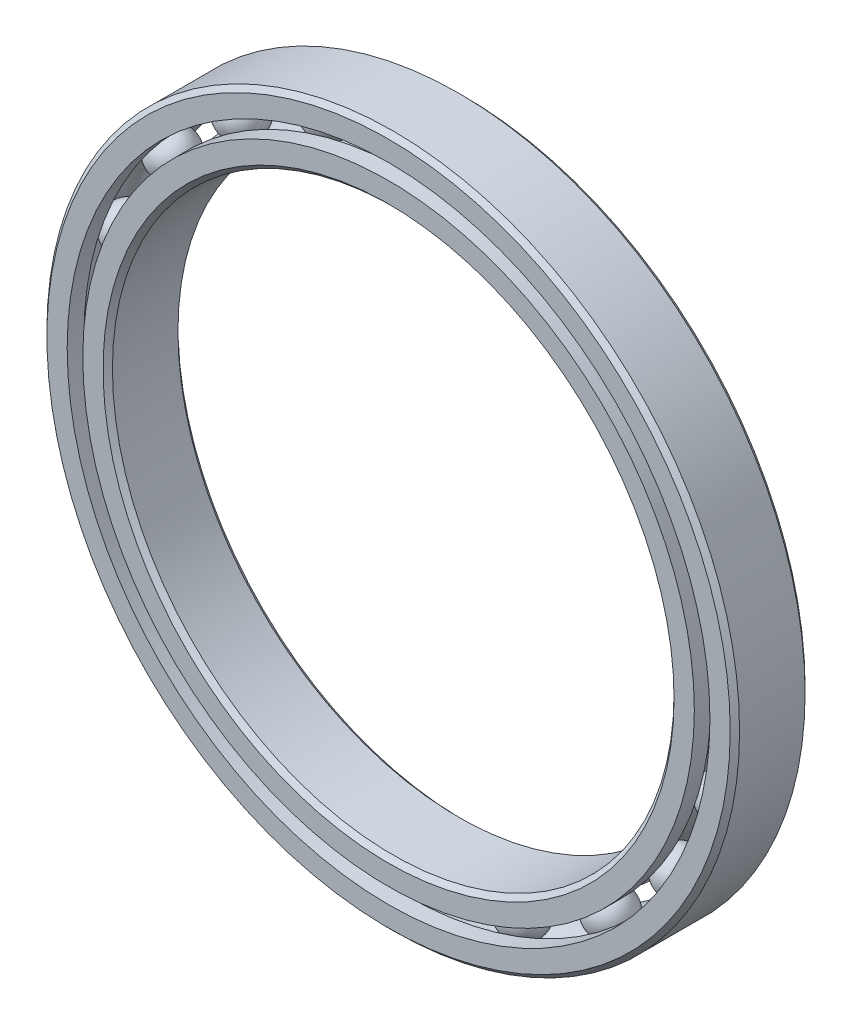
ISO-10303-21;
HEADER;
FILE_DESCRIPTION(('STEP AP214'),'2;1');
FILE_NAME('part.step','',(''),(''),'','','');
FILE_SCHEMA(('AUTOMOTIVE_DESIGN { 1 0 10303 214 1 1 1 1 }'));
ENDSEC;
DATA;
#1=APPLICATION_CONTEXT('core data for automotive mechanical design processes');
#2=APPLICATION_PROTOCOL_DEFINITION('international standard','automotive_design',2000,#1);
#3=PRODUCT_CONTEXT('',#1,'mechanical');
#4=PRODUCT('Part','Part','',(#3));
#5=PRODUCT_RELATED_PRODUCT_CATEGORY('part','',(#4));
#6=PRODUCT_DEFINITION_FORMATION('','',#4);
#7=PRODUCT_DEFINITION_CONTEXT('part definition',#1,'design');
#8=PRODUCT_DEFINITION('design','',#6,#7);
#9=PRODUCT_DEFINITION_SHAPE('','',#8);
#10=(LENGTH_UNIT() NAMED_UNIT(*) SI_UNIT(.MILLI.,.METRE.));
#11=(NAMED_UNIT(*) PLANE_ANGLE_UNIT() SI_UNIT($,.RADIAN.));
#12=(NAMED_UNIT(*) SI_UNIT($,.STERADIAN.) SOLID_ANGLE_UNIT());
#13=UNCERTAINTY_MEASURE_WITH_UNIT(LENGTH_MEASURE(1.E-05),#10,'distance_accuracy_value','');
#14=(GEOMETRIC_REPRESENTATION_CONTEXT(3) GLOBAL_UNCERTAINTY_ASSIGNED_CONTEXT((#13)) GLOBAL_UNIT_ASSIGNED_CONTEXT((#10,
#11,#12)) REPRESENTATION_CONTEXT('',''));
#15=CARTESIAN_POINT('',(0.,0.,0.));
#16=DIRECTION('',(0.,0.,1.));
#17=DIRECTION('',(1.,0.,0.));
#18=AXIS2_PLACEMENT_3D('',#15,#16,#17);
#19=CARTESIAN_POINT('',(-5.17603465578016,15.9301966479439,0.));
#20=DIRECTION('',(0.,0.,1.));
#21=DIRECTION('',(-0.309016994374935,0.951056516295158,0.));
#22=AXIS2_PLACEMENT_3D('',#19,#20,#21);
#23=SPHERICAL_SURFACE('',#22,1.18671409240088);
#24=CARTESIAN_POINT('',(-5.17603465578016,15.9301966479439,1.18671409240088));
#25=VERTEX_POINT('',#24);
#26=VERTEX_LOOP('',#25);
#27=FACE_BOUND('',#26,.T.);
#28=ADVANCED_FACE('F38',(#27),#23,.T.);
#29=CLOSED_SHELL('',(#28));
#30=MANIFOLD_SOLID_BREP('B2',#29);
#31=CARTESIAN_POINT('',(-9.84540297589875,13.5510346557805,0.));
#32=DIRECTION('',(0.,0.,1.));
#33=DIRECTION('',(-0.587785252292462,0.809016994374955,0.));
#34=AXIS2_PLACEMENT_3D('',#31,#32,#33);
#35=SPHERICAL_SURFACE('',#34,1.18671409240088);
#36=CARTESIAN_POINT('',(-9.84540297589875,13.5510346557805,1.18671409240088));
#37=VERTEX_POINT('',#36);
#38=VERTEX_LOOP('',#37);
#39=FACE_BOUND('',#38,.T.);
#40=ADVANCED_FACE('F59',(#39),#35,.T.);
#41=CLOSED_SHELL('',(#40));
#42=MANIFOLD_SOLID_BREP('B6',#41);
#43=CARTESIAN_POINT('',(-13.5510346557802,9.84540297589909,0.));
#44=DIRECTION('',(0.,0.,1.));
#45=DIRECTION('',(-0.80901699437494,0.587785252292483,0.));
#46=AXIS2_PLACEMENT_3D('',#43,#44,#45);
#47=SPHERICAL_SURFACE('',#46,1.18671409240088);
#48=CARTESIAN_POINT('',(-13.5510346557802,9.84540297589909,1.18671409240088));
#49=VERTEX_POINT('',#48);
#50=VERTEX_LOOP('',#49);
#51=FACE_BOUND('',#50,.T.);
#52=ADVANCED_FACE('F80',(#51),#47,.T.);
#53=CLOSED_SHELL('',(#52));
#54=MANIFOLD_SOLID_BREP('B34',#53);
#55=CARTESIAN_POINT('',(-15.9301966479438,5.17603465578055,0.));
#56=DIRECTION('',(0.,0.,1.));
#57=DIRECTION('',(-0.95105651629515,0.309016994374958,0.));
#58=AXIS2_PLACEMENT_3D('',#55,#56,#57);
#59=SPHERICAL_SURFACE('',#58,1.18671409240088);
#60=CARTESIAN_POINT('',(-15.9301966479438,5.17603465578055,1.18671409240088));
#61=VERTEX_POINT('',#60);
#62=VERTEX_LOOP('',#61);
#63=FACE_BOUND('',#62,.T.);
#64=ADVANCED_FACE('F101',(#63),#59,.T.);
#65=CLOSED_SHELL('',(#64));
#66=MANIFOLD_SOLID_BREP('B55',#65);
#67=CARTESIAN_POINT('',(-16.75,1.75446937276867E-13,0.));
#68=DIRECTION('',(0.,0.,1.));
#69=DIRECTION('',(-1.,0.,0.));
#70=AXIS2_PLACEMENT_3D('',#67,#68,#69);
#71=SPHERICAL_SURFACE('',#70,1.18671409240088);
#72=CARTESIAN_POINT('',(-16.75,1.75446937276867E-13,1.18671409240088));
#73=VERTEX_POINT('',#72);
#74=VERTEX_LOOP('',#73);
#75=FACE_BOUND('',#74,.T.);
#76=ADVANCED_FACE('F122',(#75),#71,.T.);
#77=CLOSED_SHELL('',(#76));
#78=MANIFOLD_SOLID_BREP('B76',#77);
#79=CARTESIAN_POINT('',(-15.9301966479439,-5.17603465578022,0.));
#80=DIRECTION('',(0.,0.,1.));
#81=DIRECTION('',(-0.951056516295157,-0.309016994374938,0.));
#82=AXIS2_PLACEMENT_3D('',#79,#80,#81);
#83=SPHERICAL_SURFACE('',#82,1.18671409240088);
#84=CARTESIAN_POINT('',(-15.9301966479439,-5.17603465578022,1.18671409240088));
#85=VERTEX_POINT('',#84);
#86=VERTEX_LOOP('',#85);
#87=FACE_BOUND('',#86,.T.);
#88=ADVANCED_FACE('F143',(#87),#83,.T.);
#89=CLOSED_SHELL('',(#88));
#90=MANIFOLD_SOLID_BREP('B97',#89);
#91=CARTESIAN_POINT('',(-13.5510346557805,-9.84540297589879,0.));
#92=DIRECTION('',(0.,0.,1.));
#93=DIRECTION('',(-0.809016994374953,-0.587785252292465,0.));
#94=AXIS2_PLACEMENT_3D('',#91,#92,#93);
#95=SPHERICAL_SURFACE('',#94,1.18671409240088);
#96=CARTESIAN_POINT('',(-13.5510346557805,-9.84540297589879,1.18671409240088));
#97=VERTEX_POINT('',#96);
#98=VERTEX_LOOP('',#97);
#99=FACE_BOUND('',#98,.T.);
#100=ADVANCED_FACE('F164',(#99),#95,.T.);
#101=CLOSED_SHELL('',(#100));
#102=MANIFOLD_SOLID_BREP('B118',#101);
#103=CARTESIAN_POINT('',(-9.84540297589905,-13.5510346557803,0.));
#104=DIRECTION('',(0.,0.,1.));
#105=DIRECTION('',(-0.58778525229248,-0.809016994374942,0.));
#106=AXIS2_PLACEMENT_3D('',#103,#104,#105);
#107=SPHERICAL_SURFACE('',#106,1.18671409240088);
#108=CARTESIAN_POINT('',(-9.84540297589905,-13.5510346557803,1.18671409240088));
#109=VERTEX_POINT('',#108);
#110=VERTEX_LOOP('',#109);
#111=FACE_BOUND('',#110,.T.);
#112=ADVANCED_FACE('F185',(#111),#107,.T.);
#113=CLOSED_SHELL('',(#112));
#114=MANIFOLD_SOLID_BREP('B139',#113);
#115=CARTESIAN_POINT('',(-5.17603465578049,-15.9301966479438,0.));
#116=DIRECTION('',(0.,0.,1.));
#117=DIRECTION('',(-0.309016994374955,-0.951056516295151,0.));
#118=AXIS2_PLACEMENT_3D('',#115,#116,#117);
#119=SPHERICAL_SURFACE('',#118,1.18671409240088);
#120=CARTESIAN_POINT('',(-5.17603465578049,-15.9301966479438,1.18671409240088));
#121=VERTEX_POINT('',#120);
#122=VERTEX_LOOP('',#121);
#123=FACE_BOUND('',#122,.T.);
#124=ADVANCED_FACE('F206',(#123),#119,.T.);
#125=CLOSED_SHELL('',(#124));
#126=MANIFOLD_SOLID_BREP('B160',#125);
#127=CARTESIAN_POINT('',(-1.16964624851245E-13,-16.75,0.));
#128=DIRECTION('',(0.,0.,1.));
#129=DIRECTION('',(0.,-1.,0.));
#130=AXIS2_PLACEMENT_3D('',#127,#128,#129);
#131=SPHERICAL_SURFACE('',#130,1.18671409240088);
#132=CARTESIAN_POINT('',(-1.16964624851245E-13,-16.75,1.18671409240088));
#133=VERTEX_POINT('',#132);
#134=VERTEX_LOOP('',#133);
#135=FACE_BOUND('',#134,.T.);
#136=ADVANCED_FACE('F227',(#135),#131,.T.);
#137=CLOSED_SHELL('',(#136));
#138=MANIFOLD_SOLID_BREP('B181',#137);
#139=CARTESIAN_POINT('',(5.17603465578026,-15.9301966479439,0.));
#140=DIRECTION('',(0.,0.,1.));
#141=DIRECTION('',(0.309016994374941,-0.951056516295156,0.));
#142=AXIS2_PLACEMENT_3D('',#139,#140,#141);
#143=SPHERICAL_SURFACE('',#142,1.18671409240088);
#144=CARTESIAN_POINT('',(5.17603465578026,-15.9301966479439,1.18671409240088));
#145=VERTEX_POINT('',#144);
#146=VERTEX_LOOP('',#145);
#147=FACE_BOUND('',#146,.T.);
#148=ADVANCED_FACE('F248',(#147),#143,.T.);
#149=CLOSED_SHELL('',(#148));
#150=MANIFOLD_SOLID_BREP('B202',#149);
#151=CARTESIAN_POINT('',(9.84540297589885,-13.5510346557804,0.));
#152=DIRECTION('',(0.,0.,1.));
#153=DIRECTION('',(0.587785252292469,-0.809016994374951,0.));
#154=AXIS2_PLACEMENT_3D('',#151,#152,#153);
#155=SPHERICAL_SURFACE('',#154,1.18671409240088);
#156=CARTESIAN_POINT('',(9.84540297589885,-13.5510346557804,1.18671409240088));
#157=VERTEX_POINT('',#156);
#158=VERTEX_LOOP('',#157);
#159=FACE_BOUND('',#158,.T.);
#160=ADVANCED_FACE('F269',(#159),#155,.T.);
#161=CLOSED_SHELL('',(#160));
#162=MANIFOLD_SOLID_BREP('B223',#161);
#163=CARTESIAN_POINT('',(13.5510346557803,-9.84540297589899,0.));
#164=DIRECTION('',(0.,0.,1.));
#165=DIRECTION('',(0.809016994374945,-0.587785252292477,0.));
#166=AXIS2_PLACEMENT_3D('',#163,#164,#165);
#167=SPHERICAL_SURFACE('',#166,1.18671409240088);
#168=CARTESIAN_POINT('',(13.5510346557803,-9.84540297589899,1.18671409240088));
#169=VERTEX_POINT('',#168);
#170=VERTEX_LOOP('',#169);
#171=FACE_BOUND('',#170,.T.);
#172=ADVANCED_FACE('F290',(#171),#167,.T.);
#173=CLOSED_SHELL('',(#172));
#174=MANIFOLD_SOLID_BREP('B244',#173);
#175=CARTESIAN_POINT('',(15.9301966479438,-5.17603465578044,0.));
#176=DIRECTION('',(0.,0.,1.));
#177=DIRECTION('',(0.951056516295152,-0.309016994374952,0.));
#178=AXIS2_PLACEMENT_3D('',#175,#176,#177);
#179=SPHERICAL_SURFACE('',#178,1.18671409240088);
#180=CARTESIAN_POINT('',(15.9301966479438,-5.17603465578044,1.18671409240088));
#181=VERTEX_POINT('',#180);
#182=VERTEX_LOOP('',#181);
#183=FACE_BOUND('',#182,.T.);
#184=ADVANCED_FACE('F311',(#183),#179,.T.);
#185=CLOSED_SHELL('',(#184));
#186=MANIFOLD_SOLID_BREP('B265',#185);
#187=CARTESIAN_POINT('',(16.75,0.,0.));
#188=DIRECTION('',(0.,0.,1.));
#189=DIRECTION('',(1.,0.,0.));
#190=AXIS2_PLACEMENT_3D('',#187,#188,#189);
#191=SPHERICAL_SURFACE('',#190,1.18671409240088);
#192=CARTESIAN_POINT('',(16.75,0.,1.18671409240088));
#193=VERTEX_POINT('',#192);
#194=VERTEX_LOOP('',#193);
#195=FACE_BOUND('',#194,.T.);
#196=ADVANCED_FACE('F332',(#195),#191,.T.);
#197=CLOSED_SHELL('',(#196));
#198=MANIFOLD_SOLID_BREP('B286',#197);
#199=CARTESIAN_POINT('',(15.9301966479438,5.17603465578033,0.));
#200=DIRECTION('',(0.,0.,1.));
#201=DIRECTION('',(0.951056516295155,0.309016994374945,0.));
#202=AXIS2_PLACEMENT_3D('',#199,#200,#201);
#203=SPHERICAL_SURFACE('',#202,1.18671409240088);
#204=CARTESIAN_POINT('',(15.9301966479438,5.17603465578033,1.18671409240088));
#205=VERTEX_POINT('',#204);
#206=VERTEX_LOOP('',#205);
#207=FACE_BOUND('',#206,.T.);
#208=ADVANCED_FACE('F353',(#207),#203,.T.);
#209=CLOSED_SHELL('',(#208));
#210=MANIFOLD_SOLID_BREP('B307',#209);
#211=CARTESIAN_POINT('',(13.5510346557804,9.8454029758989,0.));
#212=DIRECTION('',(0.,0.,1.));
#213=DIRECTION('',(0.809016994374949,0.587785252292471,0.));
#214=AXIS2_PLACEMENT_3D('',#211,#212,#213);
#215=SPHERICAL_SURFACE('',#214,1.18671409240088);
#216=CARTESIAN_POINT('',(13.5510346557804,9.8454029758989,1.18671409240088));
#217=VERTEX_POINT('',#216);
#218=VERTEX_LOOP('',#217);
#219=FACE_BOUND('',#218,.T.);
#220=ADVANCED_FACE('F374',(#219),#215,.T.);
#221=CLOSED_SHELL('',(#220));
#222=MANIFOLD_SOLID_BREP('B328',#221);
#223=CARTESIAN_POINT('',(9.84540297589895,13.5510346557804,0.));
#224=DIRECTION('',(0.,0.,1.));
#225=DIRECTION('',(0.587785252292474,0.809016994374947,0.));
#226=AXIS2_PLACEMENT_3D('',#223,#224,#225);
#227=SPHERICAL_SURFACE('',#226,1.18671409240088);
#228=CARTESIAN_POINT('',(9.84540297589895,13.5510346557804,1.18671409240088));
#229=VERTEX_POINT('',#228);
#230=VERTEX_LOOP('',#229);
#231=FACE_BOUND('',#230,.T.);
#232=ADVANCED_FACE('F395',(#231),#227,.T.);
#233=CLOSED_SHELL('',(#232));
#234=MANIFOLD_SOLID_BREP('B349',#233);
#235=CARTESIAN_POINT('',(5.17603465578038,15.9301966479438,0.));
#236=DIRECTION('',(0.,0.,1.));
#237=DIRECTION('',(0.309016994374948,0.951056516295154,0.));
#238=AXIS2_PLACEMENT_3D('',#235,#236,#237);
#239=SPHERICAL_SURFACE('',#238,1.18671409240088);
#240=CARTESIAN_POINT('',(5.17603465578038,15.9301966479438,1.18671409240088));
#241=VERTEX_POINT('',#240);
#242=VERTEX_LOOP('',#241);
#243=FACE_BOUND('',#242,.T.);
#244=ADVANCED_FACE('F416',(#243),#239,.T.);
#245=CLOSED_SHELL('',(#244));
#246=MANIFOLD_SOLID_BREP('B370',#245);
#247=CARTESIAN_POINT('',(0.,16.75,0.));
#248=DIRECTION('',(0.,0.,1.));
#249=DIRECTION('',(0.,1.,0.));
#250=AXIS2_PLACEMENT_3D('',#247,#248,#249);
#251=SPHERICAL_SURFACE('',#250,1.18671409240088);
#252=CARTESIAN_POINT('',(0.,16.75,1.18671409240088));
#253=VERTEX_POINT('',#252);
#254=VERTEX_LOOP('',#253);
#255=FACE_BOUND('',#254,.T.);
#256=ADVANCED_FACE('F439',(#255),#251,.T.);
#257=CLOSED_SHELL('',(#256));
#258=MANIFOLD_SOLID_BREP('B391',#257);
#259=CARTESIAN_POINT('',(0.,16.3331997650333,2.));
#260=DIRECTION('',(0.,0.,-1.));
#261=DIRECTION('',(-1.,0.,0.));
#262=AXIS2_PLACEMENT_3D('',#259,#260,#261);
#263=PLANE('',#262);
#264=CARTESIAN_POINT('',(0.,0.,2.));
#265=DIRECTION('',(0.,0.,1.));
#266=DIRECTION('',(1.,0.,0.));
#267=AXIS2_PLACEMENT_3D('',#264,#265,#266);
#268=CIRCLE('',#267,15.25);
#269=CARTESIAN_POINT('',(15.25,0.,2.));
#270=VERTEX_POINT('',#269);
#271=EDGE_CURVE('E487',#270,#270,#268,.T.);
#272=ORIENTED_EDGE('',*,*,#271,.F.);
#273=EDGE_LOOP('',(#272));
#274=FACE_BOUND('',#273,.T.);
#275=CARTESIAN_POINT('',(0.,0.,2.));
#276=DIRECTION('',(0.,0.,1.));
#277=DIRECTION('',(1.,0.,0.));
#278=AXIS2_PLACEMENT_3D('',#275,#276,#277);
#279=CIRCLE('',#278,16.3331997650333);
#280=CARTESIAN_POINT('',(16.3331997650333,0.,2.));
#281=VERTEX_POINT('',#280);
#282=EDGE_CURVE('E438',#281,#281,#279,.T.);
#283=ORIENTED_EDGE('',*,*,#282,.T.);
#284=EDGE_LOOP('',(#283));
#285=FACE_BOUND('',#284,.T.);
#286=ADVANCED_FACE('F459',(#274,#285),#263,.F.);
#287=CARTESIAN_POINT('',(0.,0.,2.));
#288=DIRECTION('',(0.,0.,1.));
#289=DIRECTION('',(1.,0.,0.));
#290=AXIS2_PLACEMENT_3D('',#287,#288,#289);
#291=CYLINDRICAL_SURFACE('',#290,16.3331997650333);
#292=ORIENTED_EDGE('',*,*,#282,.F.);
#293=EDGE_LOOP('',(#292));
#294=FACE_BOUND('',#293,.T.);
#295=CARTESIAN_POINT('',(0.,0.,1.11111111111111));
#296=DIRECTION('',(0.,0.,1.));
#297=DIRECTION('',(1.,0.,0.));
#298=AXIS2_PLACEMENT_3D('',#295,#296,#297);
#299=CIRCLE('',#298,16.3331997650333);
#300=CARTESIAN_POINT('',(16.3331997650333,0.,1.11111111111111));
#301=VERTEX_POINT('',#300);
#302=EDGE_CURVE('E465',#301,#301,#299,.T.);
#303=ORIENTED_EDGE('',*,*,#302,.T.);
#304=EDGE_LOOP('',(#303));
#305=FACE_BOUND('',#304,.T.);
#306=ADVANCED_FACE('F494',(#294,#305),#291,.T.);
#307=CARTESIAN_POINT('',(0.,0.,0.));
#308=DIRECTION('',(0.,0.,1.));
#309=DIRECTION('',(1.,0.,0.));
#310=AXIS2_PLACEMENT_3D('',#307,#308,#309);
#311=TOROIDAL_SURFACE('',#310,16.75,1.18671409240087);
#312=ORIENTED_EDGE('',*,*,#302,.F.);
#313=EDGE_LOOP('',(#312));
#314=FACE_BOUND('',#313,.T.);
#315=CARTESIAN_POINT('',(0.,0.,-1.11111111111111));
#316=DIRECTION('',(0.,0.,1.));
#317=DIRECTION('',(1.,0.,0.));
#318=AXIS2_PLACEMENT_3D('',#315,#316,#317);
#319=CIRCLE('',#318,16.3331997650333);
#320=CARTESIAN_POINT('',(16.3331997650333,0.,-1.11111111111111));
#321=VERTEX_POINT('',#320);
#322=EDGE_CURVE('E469',#321,#321,#319,.T.);
#323=ORIENTED_EDGE('',*,*,#322,.T.);
#324=EDGE_LOOP('',(#323));
#325=FACE_BOUND('',#324,.T.);
#326=ADVANCED_FACE('F498',(#314,#325),#311,.F.);
#327=CARTESIAN_POINT('',(0.,0.,2.));
#328=DIRECTION('',(0.,0.,1.));
#329=DIRECTION('',(1.,0.,0.));
#330=AXIS2_PLACEMENT_3D('',#327,#328,#329);
#331=CYLINDRICAL_SURFACE('',#330,16.3331997650333);
#332=ORIENTED_EDGE('',*,*,#322,.F.);
#333=EDGE_LOOP('',(#332));
#334=FACE_BOUND('',#333,.T.);
#335=CARTESIAN_POINT('',(0.,0.,-2.));
#336=DIRECTION('',(0.,0.,1.));
#337=DIRECTION('',(1.,0.,0.));
#338=AXIS2_PLACEMENT_3D('',#335,#336,#337);
#339=CIRCLE('',#338,16.3331997650333);
#340=CARTESIAN_POINT('',(16.3331997650333,0.,-2.));
#341=VERTEX_POINT('',#340);
#342=EDGE_CURVE('E473',#341,#341,#339,.T.);
#343=ORIENTED_EDGE('',*,*,#342,.T.);
#344=EDGE_LOOP('',(#343));
#345=FACE_BOUND('',#344,.T.);
#346=ADVANCED_FACE('F503',(#334,#345),#331,.T.);
#347=CARTESIAN_POINT('',(0.,15.25,-2.));
#348=DIRECTION('',(0.,0.,1.));
#349=DIRECTION('',(1.,0.,0.));
#350=AXIS2_PLACEMENT_3D('',#347,#348,#349);
#351=PLANE('',#350);
#352=ORIENTED_EDGE('',*,*,#342,.F.);
#353=EDGE_LOOP('',(#352));
#354=FACE_BOUND('',#353,.T.);
#355=CARTESIAN_POINT('',(0.,0.,-2.));
#356=DIRECTION('',(0.,0.,1.));
#357=DIRECTION('',(1.,0.,0.));
#358=AXIS2_PLACEMENT_3D('',#355,#356,#357);
#359=CIRCLE('',#358,15.25);
#360=CARTESIAN_POINT('',(15.25,0.,-2.));
#361=VERTEX_POINT('',#360);
#362=EDGE_CURVE('E478',#361,#361,#359,.T.);
#363=ORIENTED_EDGE('',*,*,#362,.T.);
#364=EDGE_LOOP('',(#363));
#365=FACE_BOUND('',#364,.T.);
#366=ADVANCED_FACE('F509',(#354,#365),#351,.F.);
#367=CARTESIAN_POINT('',(0.,0.,-1.75));
#368=DIRECTION('',(0.,0.,-1.));
#369=DIRECTION('',(-1.,0.,0.));
#370=AXIS2_PLACEMENT_3D('',#367,#368,#369);
#371=CONICAL_SURFACE('',#370,15.,0.785398163397448);
#372=ORIENTED_EDGE('',*,*,#362,.F.);
#373=EDGE_LOOP('',(#372));
#374=FACE_BOUND('',#373,.T.);
#375=CARTESIAN_POINT('',(0.,0.,-1.75));
#376=DIRECTION('',(0.,0.,1.));
#377=DIRECTION('',(1.,0.,0.));
#378=AXIS2_PLACEMENT_3D('',#375,#376,#377);
#379=CIRCLE('',#378,15.);
#380=CARTESIAN_POINT('',(15.,0.,-1.75));
#381=VERTEX_POINT('',#380);
#382=EDGE_CURVE('E481',#381,#381,#379,.T.);
#383=ORIENTED_EDGE('',*,*,#382,.T.);
#384=EDGE_LOOP('',(#383));
#385=FACE_BOUND('',#384,.T.);
#386=ADVANCED_FACE('F513',(#374,#385),#371,.F.);
#387=CARTESIAN_POINT('',(0.,0.,2.));
#388=DIRECTION('',(0.,0.,1.));
#389=DIRECTION('',(1.,0.,0.));
#390=AXIS2_PLACEMENT_3D('',#387,#388,#389);
#391=CYLINDRICAL_SURFACE('',#390,15.);
#392=ORIENTED_EDGE('',*,*,#382,.F.);
#393=EDGE_LOOP('',(#392));
#394=FACE_BOUND('',#393,.T.);
#395=CARTESIAN_POINT('',(0.,0.,1.75));
#396=DIRECTION('',(0.,0.,1.));
#397=DIRECTION('',(1.,0.,0.));
#398=AXIS2_PLACEMENT_3D('',#395,#396,#397);
#399=CIRCLE('',#398,15.);
#400=CARTESIAN_POINT('',(15.,0.,1.75));
#401=VERTEX_POINT('',#400);
#402=EDGE_CURVE('E484',#401,#401,#399,.T.);
#403=ORIENTED_EDGE('',*,*,#402,.T.);
#404=EDGE_LOOP('',(#403));
#405=FACE_BOUND('',#404,.T.);
#406=ADVANCED_FACE('F517',(#394,#405),#391,.F.);
#407=CARTESIAN_POINT('',(0.,0.,2.));
#408=DIRECTION('',(0.,0.,1.));
#409=DIRECTION('',(1.,0.,0.));
#410=AXIS2_PLACEMENT_3D('',#407,#408,#409);
#411=CONICAL_SURFACE('',#410,15.25,0.785398163397448);
#412=ORIENTED_EDGE('',*,*,#402,.F.);
#413=EDGE_LOOP('',(#412));
#414=FACE_BOUND('',#413,.T.);
#415=ORIENTED_EDGE('',*,*,#271,.T.);
#416=EDGE_LOOP('',(#415));
#417=FACE_BOUND('',#416,.T.);
#418=ADVANCED_FACE('F491',(#414,#417),#411,.F.);
#419=CLOSED_SHELL('',(#286,#306,#326,#346,#366,#386,#406,#418));
#420=MANIFOLD_SOLID_BREP('B412',#419);
#421=CARTESIAN_POINT('',(0.,0.,1.75));
#422=DIRECTION('',(0.,0.,-1.));
#423=DIRECTION('',(-1.,0.,0.));
#424=AXIS2_PLACEMENT_3D('',#421,#422,#423);
#425=CONICAL_SURFACE('',#424,18.5,0.785398163397448);
#426=CARTESIAN_POINT('',(0.,0.,2.));
#427=DIRECTION('',(0.,0.,1.));
#428=DIRECTION('',(1.,0.,0.));
#429=AXIS2_PLACEMENT_3D('',#426,#427,#428);
#430=CIRCLE('',#429,18.25);
#431=CARTESIAN_POINT('',(18.25,0.,2.));
#432=VERTEX_POINT('',#431);
#433=EDGE_CURVE('E609',#432,#432,#430,.T.);
#434=ORIENTED_EDGE('',*,*,#433,.F.);
#435=EDGE_LOOP('',(#434));
#436=FACE_BOUND('',#435,.T.);
#437=CARTESIAN_POINT('',(0.,0.,1.75));
#438=DIRECTION('',(0.,0.,1.));
#439=DIRECTION('',(1.,0.,0.));
#440=AXIS2_PLACEMENT_3D('',#437,#438,#439);
#441=CIRCLE('',#440,18.5);
#442=CARTESIAN_POINT('',(18.5,0.,1.75));
#443=VERTEX_POINT('',#442);
#444=EDGE_CURVE('E458',#443,#443,#441,.T.);
#445=ORIENTED_EDGE('',*,*,#444,.T.);
#446=EDGE_LOOP('',(#445));
#447=FACE_BOUND('',#446,.T.);
#448=ADVANCED_FACE('F581',(#436,#447),#425,.T.);
#449=CARTESIAN_POINT('',(0.,0.,2.));
#450=DIRECTION('',(0.,0.,1.));
#451=DIRECTION('',(1.,0.,0.));
#452=AXIS2_PLACEMENT_3D('',#449,#450,#451);
#453=CYLINDRICAL_SURFACE('',#452,18.5);
#454=ORIENTED_EDGE('',*,*,#444,.F.);
#455=EDGE_LOOP('',(#454));
#456=FACE_BOUND('',#455,.T.);
#457=CARTESIAN_POINT('',(0.,0.,-1.75));
#458=DIRECTION('',(0.,0.,1.));
#459=DIRECTION('',(1.,0.,0.));
#460=AXIS2_PLACEMENT_3D('',#457,#458,#459);
#461=CIRCLE('',#460,18.5);
#462=CARTESIAN_POINT('',(18.5,0.,-1.75));
#463=VERTEX_POINT('',#462);
#464=EDGE_CURVE('E587',#463,#463,#461,.T.);
#465=ORIENTED_EDGE('',*,*,#464,.T.);
#466=EDGE_LOOP('',(#465));
#467=FACE_BOUND('',#466,.T.);
#468=ADVANCED_FACE('F616',(#456,#467),#453,.T.);
#469=CARTESIAN_POINT('',(0.,0.,-2.));
#470=DIRECTION('',(0.,0.,1.));
#471=DIRECTION('',(1.,0.,0.));
#472=AXIS2_PLACEMENT_3D('',#469,#470,#471);
#473=CONICAL_SURFACE('',#472,18.25,0.785398163397448);
#474=ORIENTED_EDGE('',*,*,#464,.F.);
#475=EDGE_LOOP('',(#474));
#476=FACE_BOUND('',#475,.T.);
#477=CARTESIAN_POINT('',(0.,0.,-2.));
#478=DIRECTION('',(0.,0.,1.));
#479=DIRECTION('',(1.,0.,0.));
#480=AXIS2_PLACEMENT_3D('',#477,#478,#479);
#481=CIRCLE('',#480,18.25);
#482=CARTESIAN_POINT('',(18.25,0.,-2.));
#483=VERTEX_POINT('',#482);
#484=EDGE_CURVE('E591',#483,#483,#481,.T.);
#485=ORIENTED_EDGE('',*,*,#484,.T.);
#486=EDGE_LOOP('',(#485));
#487=FACE_BOUND('',#486,.T.);
#488=ADVANCED_FACE('F620',(#476,#487),#473,.T.);
#489=CARTESIAN_POINT('',(0.,18.25,-2.00000000000001));
#490=DIRECTION('',(0.,0.,1.));
#491=DIRECTION('',(1.,0.,0.));
#492=AXIS2_PLACEMENT_3D('',#489,#490,#491);
#493=PLANE('',#492);
#494=ORIENTED_EDGE('',*,*,#484,.F.);
#495=EDGE_LOOP('',(#494));
#496=FACE_BOUND('',#495,.T.);
#497=CARTESIAN_POINT('',(0.,0.,-2.00000000000001));
#498=DIRECTION('',(0.,0.,1.));
#499=DIRECTION('',(1.,0.,0.));
#500=AXIS2_PLACEMENT_3D('',#497,#498,#499);
#501=CIRCLE('',#500,17.1668002349667);
#502=CARTESIAN_POINT('',(17.1668002349667,0.,-2.00000000000001));
#503=VERTEX_POINT('',#502);
#504=EDGE_CURVE('E595',#503,#503,#501,.T.);
#505=ORIENTED_EDGE('',*,*,#504,.T.);
#506=EDGE_LOOP('',(#505));
#507=FACE_BOUND('',#506,.T.);
#508=ADVANCED_FACE('F625',(#496,#507),#493,.F.);
#509=CARTESIAN_POINT('',(0.,0.,2.));
#510=DIRECTION('',(0.,0.,1.));
#511=DIRECTION('',(1.,0.,0.));
#512=AXIS2_PLACEMENT_3D('',#509,#510,#511);
#513=CYLINDRICAL_SURFACE('',#512,17.1668002349667);
#514=ORIENTED_EDGE('',*,*,#504,.F.);
#515=EDGE_LOOP('',(#514));
#516=FACE_BOUND('',#515,.T.);
#517=CARTESIAN_POINT('',(0.,0.,-1.11111111111112));
#518=DIRECTION('',(0.,0.,1.));
#519=DIRECTION('',(1.,0.,0.));
#520=AXIS2_PLACEMENT_3D('',#517,#518,#519);
#521=CIRCLE('',#520,17.1668002349667);
#522=CARTESIAN_POINT('',(17.1668002349667,0.,-1.11111111111112));
#523=VERTEX_POINT('',#522);
#524=EDGE_CURVE('E600',#523,#523,#521,.T.);
#525=ORIENTED_EDGE('',*,*,#524,.T.);
#526=EDGE_LOOP('',(#525));
#527=FACE_BOUND('',#526,.T.);
#528=ADVANCED_FACE('F631',(#516,#527),#513,.F.);
#529=CARTESIAN_POINT('',(0.,0.,0.));
#530=DIRECTION('',(0.,0.,1.));
#531=DIRECTION('',(1.,0.,0.));
#532=AXIS2_PLACEMENT_3D('',#529,#530,#531);
#533=TOROIDAL_SURFACE('',#532,16.75,1.18671409240088);
#534=ORIENTED_EDGE('',*,*,#524,.F.);
#535=EDGE_LOOP('',(#534));
#536=FACE_BOUND('',#535,.T.);
#537=CARTESIAN_POINT('',(0.,0.,1.11111111111111));
#538=DIRECTION('',(0.,0.,1.));
#539=DIRECTION('',(1.,0.,0.));
#540=AXIS2_PLACEMENT_3D('',#537,#538,#539);
#541=CIRCLE('',#540,17.1668002349667);
#542=CARTESIAN_POINT('',(17.1668002349667,0.,1.11111111111111));
#543=VERTEX_POINT('',#542);
#544=EDGE_CURVE('E603',#543,#543,#541,.T.);
#545=ORIENTED_EDGE('',*,*,#544,.T.);
#546=EDGE_LOOP('',(#545));
#547=FACE_BOUND('',#546,.T.);
#548=ADVANCED_FACE('F635',(#536,#547),#533,.F.);
#549=CARTESIAN_POINT('',(0.,0.,2.));
#550=DIRECTION('',(0.,0.,1.));
#551=DIRECTION('',(1.,0.,0.));
#552=AXIS2_PLACEMENT_3D('',#549,#550,#551);
#553=CYLINDRICAL_SURFACE('',#552,17.1668002349667);
#554=ORIENTED_EDGE('',*,*,#544,.F.);
#555=EDGE_LOOP('',(#554));
#556=FACE_BOUND('',#555,.T.);
#557=CARTESIAN_POINT('',(0.,0.,2.));
#558=DIRECTION('',(0.,0.,1.));
#559=DIRECTION('',(1.,0.,0.));
#560=AXIS2_PLACEMENT_3D('',#557,#558,#559);
#561=CIRCLE('',#560,17.1668002349667);
#562=CARTESIAN_POINT('',(17.1668002349667,0.,2.));
#563=VERTEX_POINT('',#562);
#564=EDGE_CURVE('E606',#563,#563,#561,.T.);
#565=ORIENTED_EDGE('',*,*,#564,.T.);
#566=EDGE_LOOP('',(#565));
#567=FACE_BOUND('',#566,.T.);
#568=ADVANCED_FACE('F639',(#556,#567),#553,.F.);
#569=CARTESIAN_POINT('',(0.,18.25,2.));
#570=DIRECTION('',(0.,0.,-1.));
#571=DIRECTION('',(-1.,0.,0.));
#572=AXIS2_PLACEMENT_3D('',#569,#570,#571);
#573=PLANE('',#572);
#574=ORIENTED_EDGE('',*,*,#564,.F.);
#575=EDGE_LOOP('',(#574));
#576=FACE_BOUND('',#575,.T.);
#577=ORIENTED_EDGE('',*,*,#433,.T.);
#578=EDGE_LOOP('',(#577));
#579=FACE_BOUND('',#578,.T.);
#580=ADVANCED_FACE('F613',(#576,#579),#573,.F.);
#581=CLOSED_SHELL('',(#448,#468,#488,#508,#528,#548,#568,#580));
#582=MANIFOLD_SOLID_BREP('B433',#581);
#583=ADVANCED_BREP_SHAPE_REPRESENTATION('',(#18,#30,#42,#54,#66,#78,#90,#102,#114,#126,#138,
#150,#162,#174,#186,#198,#210,#222,#234,#246,#258,#420,#582),#14);
#584=SHAPE_DEFINITION_REPRESENTATION(#9,#583);
ENDSEC;
END-ISO-10303-21;
